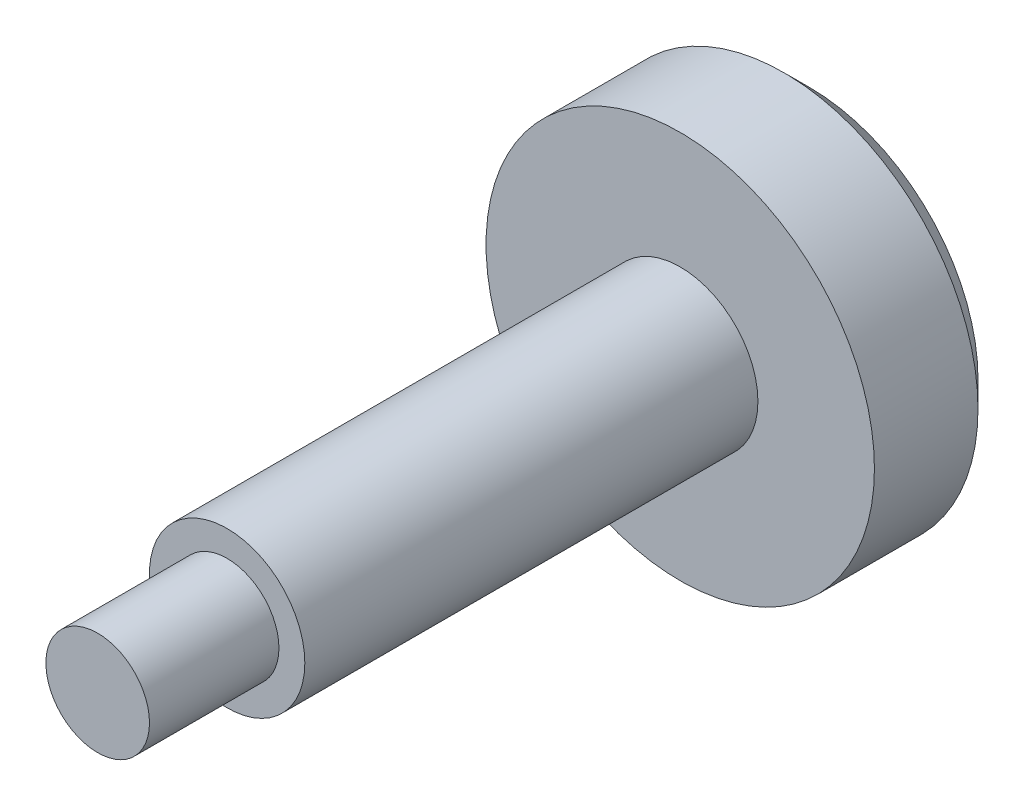
ISO-10303-21;
HEADER;
FILE_DESCRIPTION(('STEP AP214'),'2;1');
FILE_NAME('part.step','',(''),(''),'','','');
FILE_SCHEMA(('AUTOMOTIVE_DESIGN { 1 0 10303 214 1 1 1 1 }'));
ENDSEC;
DATA;
#1=APPLICATION_CONTEXT('core data for automotive mechanical design processes');
#2=APPLICATION_PROTOCOL_DEFINITION('international standard','automotive_design',2000,#1);
#3=PRODUCT_CONTEXT('',#1,'mechanical');
#4=PRODUCT('Part','Part','',(#3));
#5=PRODUCT_RELATED_PRODUCT_CATEGORY('part','',(#4));
#6=PRODUCT_DEFINITION_FORMATION('','',#4);
#7=PRODUCT_DEFINITION_CONTEXT('part definition',#1,'design');
#8=PRODUCT_DEFINITION('design','',#6,#7);
#9=PRODUCT_DEFINITION_SHAPE('','',#8);
#10=(LENGTH_UNIT() NAMED_UNIT(*) SI_UNIT(.MILLI.,.METRE.));
#11=(NAMED_UNIT(*) PLANE_ANGLE_UNIT() SI_UNIT($,.RADIAN.));
#12=(NAMED_UNIT(*) SI_UNIT($,.STERADIAN.) SOLID_ANGLE_UNIT());
#13=UNCERTAINTY_MEASURE_WITH_UNIT(LENGTH_MEASURE(1.E-05),#10,'distance_accuracy_value','');
#14=(GEOMETRIC_REPRESENTATION_CONTEXT(3) GLOBAL_UNCERTAINTY_ASSIGNED_CONTEXT((#13)) GLOBAL_UNIT_ASSIGNED_CONTEXT((#10,
#11,#12)) REPRESENTATION_CONTEXT('',''));
#15=CARTESIAN_POINT('',(0.,0.,0.));
#16=DIRECTION('',(0.,0.,1.));
#17=DIRECTION('',(1.,0.,0.));
#18=AXIS2_PLACEMENT_3D('',#15,#16,#17);
#19=CARTESIAN_POINT('',(0.,0.,10.));
#20=DIRECTION('',(0.,0.,-1.));
#21=DIRECTION('',(-1.,0.,0.));
#22=AXIS2_PLACEMENT_3D('',#19,#20,#21);
#23=CYLINDRICAL_SURFACE('',#22,15.);
#24=CARTESIAN_POINT('',(0.,0.,2.));
#25=DIRECTION('',(0.,0.,1.));
#26=DIRECTION('',(1.,0.,0.));
#27=AXIS2_PLACEMENT_3D('',#24,#25,#26);
#28=CIRCLE('',#27,15.);
#29=CARTESIAN_POINT('',(15.,0.,2.));
#30=VERTEX_POINT('',#29);
#31=EDGE_CURVE('E38',#30,#30,#28,.T.);
#32=ORIENTED_EDGE('',*,*,#31,.T.);
#33=EDGE_LOOP('',(#32));
#34=FACE_BOUND('',#33,.T.);
#35=CARTESIAN_POINT('',(0.,0.,10.));
#36=DIRECTION('',(0.,0.,1.));
#37=DIRECTION('',(1.,0.,0.));
#38=AXIS2_PLACEMENT_3D('',#35,#36,#37);
#39=CIRCLE('',#38,15.);
#40=CARTESIAN_POINT('',(15.,0.,10.));
#41=VERTEX_POINT('',#40);
#42=EDGE_CURVE('E42',#41,#41,#39,.T.);
#43=ORIENTED_EDGE('',*,*,#42,.F.);
#44=EDGE_LOOP('',(#43));
#45=FACE_BOUND('',#44,.T.);
#46=ADVANCED_FACE('F31',(#34,#45),#23,.T.);
#47=CARTESIAN_POINT('',(0.,0.,10.));
#48=DIRECTION('',(0.,0.,1.));
#49=DIRECTION('',(1.,0.,0.));
#50=AXIS2_PLACEMENT_3D('',#47,#48,#49);
#51=PLANE('',#50);
#52=CARTESIAN_POINT('',(0.,0.,10.));
#53=DIRECTION('',(0.,0.,1.));
#54=DIRECTION('',(1.,0.,0.));
#55=AXIS2_PLACEMENT_3D('',#52,#53,#54);
#56=CIRCLE('',#55,6.);
#57=CARTESIAN_POINT('',(6.,0.,10.));
#58=VERTEX_POINT('',#57);
#59=EDGE_CURVE('E49',#58,#58,#56,.T.);
#60=ORIENTED_EDGE('',*,*,#59,.F.);
#61=EDGE_LOOP('',(#60));
#62=FACE_BOUND('',#61,.T.);
#63=ORIENTED_EDGE('',*,*,#42,.T.);
#64=EDGE_LOOP('',(#63));
#65=FACE_BOUND('',#64,.T.);
#66=ADVANCED_FACE('F82',(#62,#65),#51,.T.);
#67=CARTESIAN_POINT('',(0.,0.,0.));
#68=DIRECTION('',(0.,0.,1.));
#69=DIRECTION('',(1.,0.,0.));
#70=AXIS2_PLACEMENT_3D('',#67,#68,#69);
#71=PLANE('',#70);
#72=CARTESIAN_POINT('',(0.,0.,0.));
#73=DIRECTION('',(0.,0.,1.));
#74=DIRECTION('',(1.,0.,0.));
#75=AXIS2_PLACEMENT_3D('',#72,#73,#74);
#76=CIRCLE('',#75,13.);
#77=CARTESIAN_POINT('',(13.,0.,0.));
#78=VERTEX_POINT('',#77);
#79=EDGE_CURVE('E10',#78,#78,#76,.F.);
#80=ORIENTED_EDGE('',*,*,#79,.T.);
#81=EDGE_LOOP('',(#80));
#82=FACE_BOUND('',#81,.T.);
#83=ADVANCED_FACE('F78',(#82),#71,.F.);
#84=CARTESIAN_POINT('',(0.,0.,45.));
#85=DIRECTION('',(0.,0.,-1.));
#86=DIRECTION('',(-1.,0.,0.));
#87=AXIS2_PLACEMENT_3D('',#84,#85,#86);
#88=CYLINDRICAL_SURFACE('',#87,6.);
#89=CARTESIAN_POINT('',(0.,0.,45.));
#90=DIRECTION('',(0.,0.,1.));
#91=DIRECTION('',(1.,0.,0.));
#92=AXIS2_PLACEMENT_3D('',#89,#90,#91);
#93=CIRCLE('',#92,6.);
#94=CARTESIAN_POINT('',(6.,0.,45.));
#95=VERTEX_POINT('',#94);
#96=EDGE_CURVE('E46',#95,#95,#93,.T.);
#97=ORIENTED_EDGE('',*,*,#96,.F.);
#98=EDGE_LOOP('',(#97));
#99=FACE_BOUND('',#98,.T.);
#100=ORIENTED_EDGE('',*,*,#59,.T.);
#101=EDGE_LOOP('',(#100));
#102=FACE_BOUND('',#101,.T.);
#103=ADVANCED_FACE('F72',(#99,#102),#88,.T.);
#104=CARTESIAN_POINT('',(0.,0.,45.));
#105=DIRECTION('',(0.,0.,1.));
#106=DIRECTION('',(1.,0.,0.));
#107=AXIS2_PLACEMENT_3D('',#104,#105,#106);
#108=PLANE('',#107);
#109=CARTESIAN_POINT('',(0.,0.,45.));
#110=DIRECTION('',(0.,0.,1.));
#111=DIRECTION('',(1.,0.,0.));
#112=AXIS2_PLACEMENT_3D('',#109,#110,#111);
#113=CIRCLE('',#112,4.);
#114=CARTESIAN_POINT('',(4.,0.,45.));
#115=VERTEX_POINT('',#114);
#116=EDGE_CURVE('E55',#115,#115,#113,.T.);
#117=ORIENTED_EDGE('',*,*,#116,.F.);
#118=EDGE_LOOP('',(#117));
#119=FACE_BOUND('',#118,.T.);
#120=ORIENTED_EDGE('',*,*,#96,.T.);
#121=EDGE_LOOP('',(#120));
#122=FACE_BOUND('',#121,.T.);
#123=ADVANCED_FACE('F66',(#119,#122),#108,.T.);
#124=CARTESIAN_POINT('',(0.,0.,55.));
#125=DIRECTION('',(0.,0.,-1.));
#126=DIRECTION('',(-1.,0.,0.));
#127=AXIS2_PLACEMENT_3D('',#124,#125,#126);
#128=CYLINDRICAL_SURFACE('',#127,4.);
#129=CARTESIAN_POINT('',(0.,0.,55.));
#130=DIRECTION('',(0.,0.,1.));
#131=DIRECTION('',(1.,0.,0.));
#132=AXIS2_PLACEMENT_3D('',#129,#130,#131);
#133=CIRCLE('',#132,4.);
#134=CARTESIAN_POINT('',(4.,0.,55.));
#135=VERTEX_POINT('',#134);
#136=EDGE_CURVE('E52',#135,#135,#133,.T.);
#137=ORIENTED_EDGE('',*,*,#136,.F.);
#138=EDGE_LOOP('',(#137));
#139=FACE_BOUND('',#138,.T.);
#140=ORIENTED_EDGE('',*,*,#116,.T.);
#141=EDGE_LOOP('',(#140));
#142=FACE_BOUND('',#141,.T.);
#143=ADVANCED_FACE('F63',(#139,#142),#128,.T.);
#144=CARTESIAN_POINT('',(0.,0.,55.));
#145=DIRECTION('',(0.,0.,1.));
#146=DIRECTION('',(1.,0.,0.));
#147=AXIS2_PLACEMENT_3D('',#144,#145,#146);
#148=PLANE('',#147);
#149=ORIENTED_EDGE('',*,*,#136,.T.);
#150=EDGE_LOOP('',(#149));
#151=FACE_BOUND('',#150,.T.);
#152=ADVANCED_FACE('F61',(#151),#148,.T.);
#153=CARTESIAN_POINT('',(0.,0.,2.));
#154=DIRECTION('',(0.,0.,1.));
#155=DIRECTION('',(1.,0.,0.));
#156=AXIS2_PLACEMENT_3D('',#153,#154,#155);
#157=CONICAL_SURFACE('',#156,15.,0.785398163397449);
#158=ORIENTED_EDGE('',*,*,#79,.F.);
#159=EDGE_LOOP('',(#158));
#160=FACE_BOUND('',#159,.T.);
#161=ORIENTED_EDGE('',*,*,#31,.F.);
#162=EDGE_LOOP('',(#161));
#163=FACE_BOUND('',#162,.T.);
#164=ADVANCED_FACE('F33',(#160,#163),#157,.T.);
#165=CLOSED_SHELL('',(#46,#66,#83,#103,#123,#143,#152,#164));
#166=MANIFOLD_SOLID_BREP('B2',#165);
#167=ADVANCED_BREP_SHAPE_REPRESENTATION('',(#18,#166),#14);
#168=SHAPE_DEFINITION_REPRESENTATION(#9,#167);
ENDSEC;
END-ISO-10303-21;
